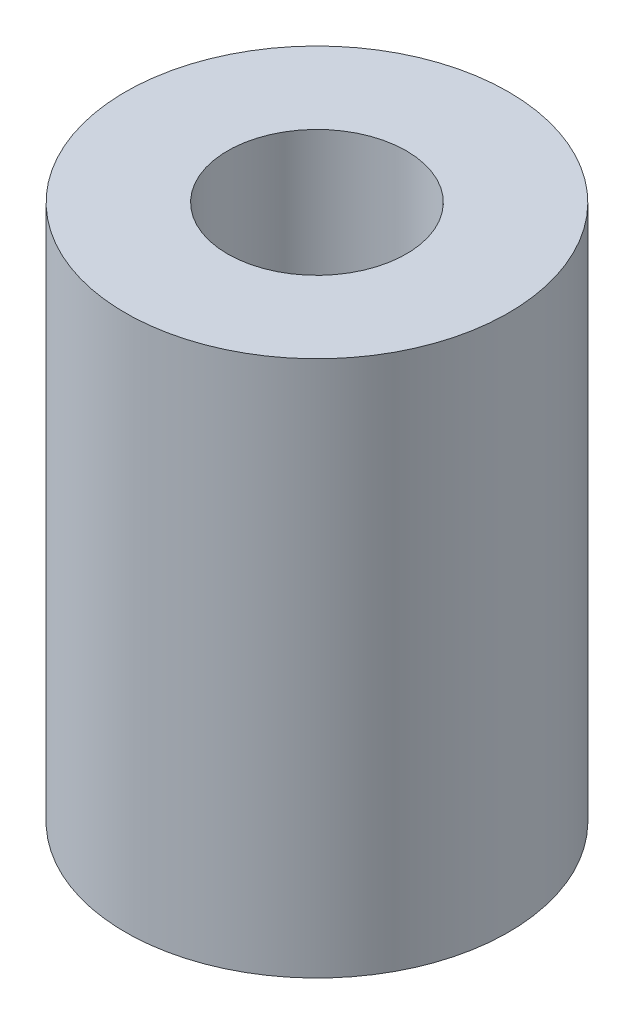
ISO-10303-21;
HEADER;
FILE_DESCRIPTION(('STEP AP214'),'2;1');
FILE_NAME('part.step','',(''),(''),'','','');
FILE_SCHEMA(('AUTOMOTIVE_DESIGN { 1 0 10303 214 1 1 1 1 }'));
ENDSEC;
DATA;
#1=APPLICATION_CONTEXT('core data for automotive mechanical design processes');
#2=APPLICATION_PROTOCOL_DEFINITION('international standard','automotive_design',2000,#1);
#3=PRODUCT_CONTEXT('',#1,'mechanical');
#4=PRODUCT('Part','Part','',(#3));
#5=PRODUCT_RELATED_PRODUCT_CATEGORY('part','',(#4));
#6=PRODUCT_DEFINITION_FORMATION('','',#4);
#7=PRODUCT_DEFINITION_CONTEXT('part definition',#1,'design');
#8=PRODUCT_DEFINITION('design','',#6,#7);
#9=PRODUCT_DEFINITION_SHAPE('','',#8);
#10=(LENGTH_UNIT() NAMED_UNIT(*) SI_UNIT(.MILLI.,.METRE.));
#11=(NAMED_UNIT(*) PLANE_ANGLE_UNIT() SI_UNIT($,.RADIAN.));
#12=(NAMED_UNIT(*) SI_UNIT($,.STERADIAN.) SOLID_ANGLE_UNIT());
#13=UNCERTAINTY_MEASURE_WITH_UNIT(LENGTH_MEASURE(1.E-05),#10,'distance_accuracy_value','');
#14=(GEOMETRIC_REPRESENTATION_CONTEXT(3) GLOBAL_UNCERTAINTY_ASSIGNED_CONTEXT((#13)) GLOBAL_UNIT_ASSIGNED_CONTEXT((#10,
#11,#12)) REPRESENTATION_CONTEXT('',''));
#15=CARTESIAN_POINT('',(0.,0.,0.));
#16=DIRECTION('',(0.,0.,1.));
#17=DIRECTION('',(1.,0.,0.));
#18=AXIS2_PLACEMENT_3D('',#15,#16,#17);
#19=CARTESIAN_POINT('',(0.,10.5,0.));
#20=DIRECTION('',(0.,-1.,0.));
#21=DIRECTION('',(0.,0.,-1.));
#22=AXIS2_PLACEMENT_3D('',#19,#20,#21);
#23=CYLINDRICAL_SURFACE('',#22,3.75);
#24=CARTESIAN_POINT('',(0.,10.5,0.));
#25=DIRECTION('',(0.,1.,0.));
#26=DIRECTION('',(0.,0.,1.));
#27=AXIS2_PLACEMENT_3D('',#24,#25,#26);
#28=CIRCLE('',#27,3.75);
#29=CARTESIAN_POINT('',(0.,10.5,-3.75));
#30=VERTEX_POINT('',#29);
#31=EDGE_CURVE('E10',#30,#30,#28,.T.);
#32=CARTESIAN_POINT('',(0.,0.,0.));
#33=DIRECTION('',(0.,1.,0.));
#34=DIRECTION('',(0.,0.,1.));
#35=AXIS2_PLACEMENT_3D('',#32,#33,#34);
#36=CIRCLE('',#35,3.75);
#37=CARTESIAN_POINT('',(0.,0.,-3.75));
#38=VERTEX_POINT('',#37);
#39=EDGE_CURVE('E46',#38,#38,#36,.T.);
#40=CARTESIAN_POINT('',(0.,10.5,-3.75));
#41=CARTESIAN_POINT('',(0.,10.390625,-3.75));
#42=CARTESIAN_POINT('',(0.,10.28125,-3.75));
#43=CARTESIAN_POINT('',(0.,10.0625,-3.75));
#44=CARTESIAN_POINT('',(0.,9.953125,-3.75));
#45=CARTESIAN_POINT('',(0.,9.734375,-3.75));
#46=CARTESIAN_POINT('',(0.,9.625,-3.75));
#47=CARTESIAN_POINT('',(0.,9.40625,-3.75));
#48=CARTESIAN_POINT('',(0.,9.296875,-3.75));
#49=CARTESIAN_POINT('',(0.,9.078125,-3.75));
#50=CARTESIAN_POINT('',(0.,8.96875,-3.75));
#51=CARTESIAN_POINT('',(0.,8.75,-3.75));
#52=CARTESIAN_POINT('',(0.,8.640625,-3.75));
#53=CARTESIAN_POINT('',(0.,8.421875,-3.75));
#54=CARTESIAN_POINT('',(0.,8.3125,-3.75));
#55=CARTESIAN_POINT('',(0.,8.09375,-3.75));
#56=CARTESIAN_POINT('',(0.,7.984375,-3.75));
#57=CARTESIAN_POINT('',(0.,7.765625,-3.75));
#58=CARTESIAN_POINT('',(0.,7.65625,-3.75));
#59=CARTESIAN_POINT('',(0.,7.4375,-3.75));
#60=CARTESIAN_POINT('',(0.,7.328125,-3.75));
#61=CARTESIAN_POINT('',(0.,7.109375,-3.75));
#62=CARTESIAN_POINT('',(0.,7.,-3.75));
#63=CARTESIAN_POINT('',(0.,6.78125,-3.75));
#64=CARTESIAN_POINT('',(0.,6.671875,-3.75));
#65=CARTESIAN_POINT('',(0.,6.453125,-3.75));
#66=CARTESIAN_POINT('',(0.,6.34375,-3.75));
#67=CARTESIAN_POINT('',(0.,6.125,-3.75));
#68=CARTESIAN_POINT('',(0.,6.015625,-3.75));
#69=CARTESIAN_POINT('',(0.,5.796875,-3.75));
#70=CARTESIAN_POINT('',(0.,5.6875,-3.75));
#71=CARTESIAN_POINT('',(0.,5.46875,-3.75));
#72=CARTESIAN_POINT('',(0.,5.359375,-3.75));
#73=CARTESIAN_POINT('',(0.,5.140625,-3.75));
#74=CARTESIAN_POINT('',(0.,5.03125,-3.75));
#75=CARTESIAN_POINT('',(0.,4.8125,-3.75));
#76=CARTESIAN_POINT('',(0.,4.703125,-3.75));
#77=CARTESIAN_POINT('',(0.,4.484375,-3.75));
#78=CARTESIAN_POINT('',(0.,4.375,-3.75));
#79=CARTESIAN_POINT('',(0.,4.15625,-3.75));
#80=CARTESIAN_POINT('',(0.,4.046875,-3.75));
#81=CARTESIAN_POINT('',(0.,3.828125,-3.75));
#82=CARTESIAN_POINT('',(0.,3.71875,-3.75));
#83=CARTESIAN_POINT('',(0.,3.5,-3.75));
#84=CARTESIAN_POINT('',(0.,3.390625,-3.75));
#85=CARTESIAN_POINT('',(0.,3.171875,-3.75));
#86=CARTESIAN_POINT('',(0.,3.0625,-3.75));
#87=CARTESIAN_POINT('',(0.,2.84375,-3.75));
#88=CARTESIAN_POINT('',(0.,2.734375,-3.75));
#89=CARTESIAN_POINT('',(0.,2.515625,-3.75));
#90=CARTESIAN_POINT('',(0.,2.40625,-3.75));
#91=CARTESIAN_POINT('',(0.,2.1875,-3.75));
#92=CARTESIAN_POINT('',(0.,2.078125,-3.75));
#93=CARTESIAN_POINT('',(0.,1.859375,-3.75));
#94=CARTESIAN_POINT('',(0.,1.75,-3.75));
#95=CARTESIAN_POINT('',(0.,1.53125,-3.75));
#96=CARTESIAN_POINT('',(0.,1.421875,-3.75));
#97=CARTESIAN_POINT('',(0.,1.203125,-3.75));
#98=CARTESIAN_POINT('',(0.,1.09375,-3.75));
#99=CARTESIAN_POINT('',(0.,0.875000000000001,-3.75));
#100=CARTESIAN_POINT('',(0.,0.765625000000001,-3.75));
#101=CARTESIAN_POINT('',(0.,0.546875,-3.75));
#102=CARTESIAN_POINT('',(0.,0.4375,-3.75));
#103=CARTESIAN_POINT('',(0.,0.21875,-3.75));
#104=CARTESIAN_POINT('',(0.,0.109375,-3.75));
#105=CARTESIAN_POINT('',(0.,0.,-3.75));
#106=B_SPLINE_CURVE_WITH_KNOTS('',3,(#40,#41,#42,#43,#44,#45,#46,#47,#48,#49,#50,#51,#52,#53,
#54,#55,#56,#57,#58,#59,#60,#61,#62,#63,#64,#65,#66,#67,#68,#69,#70,#71,#72,#73,#74,#75,#76,#77,
#78,#79,#80,#81,#82,#83,#84,#85,#86,#87,#88,#89,#90,#91,#92,#93,#94,#95,#96,#97,#98,#99,#100,
#101,#102,#103,#104,#105),.UNSPECIFIED.,.F.,.F.,(4,2,2,2,2,2,2,2,2,2,2,2,2,2,2,2,2,2,2,2,2,2,2,
2,2,2,2,2,2,2,2,2,4),(0.,0.328124999999999,0.656249999999999,0.984374999999999,1.3125,1.640625,
1.96875,2.296875,2.625,2.953125,3.28125,3.609375,3.9375,4.265625,4.59375,4.921875,5.25,5.578125,
5.90625,6.234375,6.5625,6.890625,7.21875,7.546875,7.875,8.203125,8.53125,8.859375,9.1875,
9.515625,9.84375,10.171875,10.5),.UNSPECIFIED.);
#107=EDGE_CURVE('BSEAM43',#30,#38,#106,.T.);
#108=ORIENTED_EDGE('',*,*,#31,.F.);
#109=ORIENTED_EDGE('',*,*,#39,.T.);
#110=ORIENTED_EDGE('',*,*,#107,.T.);
#111=ORIENTED_EDGE('',*,*,#107,.F.);
#112=EDGE_LOOP('',(#108,#110,#109,#111));
#113=FACE_BOUND('',#112,.T.);
#114=ADVANCED_FACE('F43',(#113),#23,.T.);
#115=CARTESIAN_POINT('',(0.,10.5,0.));
#116=DIRECTION('',(0.,1.,0.));
#117=DIRECTION('',(0.,0.,1.));
#118=AXIS2_PLACEMENT_3D('',#115,#116,#117);
#119=PLANE('',#118);
#120=CARTESIAN_POINT('',(0.,10.5,0.));
#121=DIRECTION('',(0.,1.,0.));
#122=DIRECTION('',(0.,0.,1.));
#123=AXIS2_PLACEMENT_3D('',#120,#121,#122);
#124=CIRCLE('',#123,1.75);
#125=CARTESIAN_POINT('',(0.,10.5,1.75));
#126=VERTEX_POINT('',#125);
#127=EDGE_CURVE('E60',#126,#126,#124,.T.);
#128=ORIENTED_EDGE('',*,*,#127,.F.);
#129=EDGE_LOOP('',(#128));
#130=FACE_BOUND('',#129,.T.);
#131=ORIENTED_EDGE('',*,*,#31,.T.);
#132=EDGE_LOOP('',(#131));
#133=FACE_BOUND('',#132,.T.);
#134=ADVANCED_FACE('F67',(#130,#133),#119,.T.);
#135=CARTESIAN_POINT('',(0.,0.,0.));
#136=DIRECTION('',(0.,1.,0.));
#137=DIRECTION('',(0.,0.,1.));
#138=AXIS2_PLACEMENT_3D('',#135,#136,#137);
#139=PLANE('',#138);
#140=CARTESIAN_POINT('',(0.,0.,0.));
#141=DIRECTION('',(0.,1.,0.));
#142=DIRECTION('',(0.,0.,1.));
#143=AXIS2_PLACEMENT_3D('',#140,#141,#142);
#144=CIRCLE('',#143,1.75);
#145=CARTESIAN_POINT('',(0.,0.,1.75));
#146=VERTEX_POINT('',#145);
#147=EDGE_CURVE('E55',#146,#146,#144,.T.);
#148=ORIENTED_EDGE('',*,*,#147,.T.);
#149=EDGE_LOOP('',(#148));
#150=FACE_BOUND('',#149,.T.);
#151=ORIENTED_EDGE('',*,*,#39,.F.);
#152=EDGE_LOOP('',(#151));
#153=FACE_BOUND('',#152,.T.);
#154=ADVANCED_FACE('F69',(#150,#153),#139,.F.);
#155=CARTESIAN_POINT('',(0.,10.5,0.));
#156=DIRECTION('',(0.,1.,0.));
#157=DIRECTION('',(0.,0.,1.));
#158=AXIS2_PLACEMENT_3D('',#155,#156,#157);
#159=CYLINDRICAL_SURFACE('',#158,1.75);
#160=ORIENTED_EDGE('',*,*,#147,.F.);
#161=EDGE_LOOP('',(#160));
#162=FACE_BOUND('',#161,.T.);
#163=ORIENTED_EDGE('',*,*,#127,.T.);
#164=EDGE_LOOP('',(#163));
#165=FACE_BOUND('',#164,.T.);
#166=ADVANCED_FACE('F65',(#162,#165),#159,.F.);
#167=CLOSED_SHELL('',(#114,#134,#154,#166));
#168=MANIFOLD_SOLID_BREP('B2',#167);
#169=ADVANCED_BREP_SHAPE_REPRESENTATION('',(#18,#168),#14);
#170=SHAPE_DEFINITION_REPRESENTATION(#9,#169);
ENDSEC;
END-ISO-10303-21;
